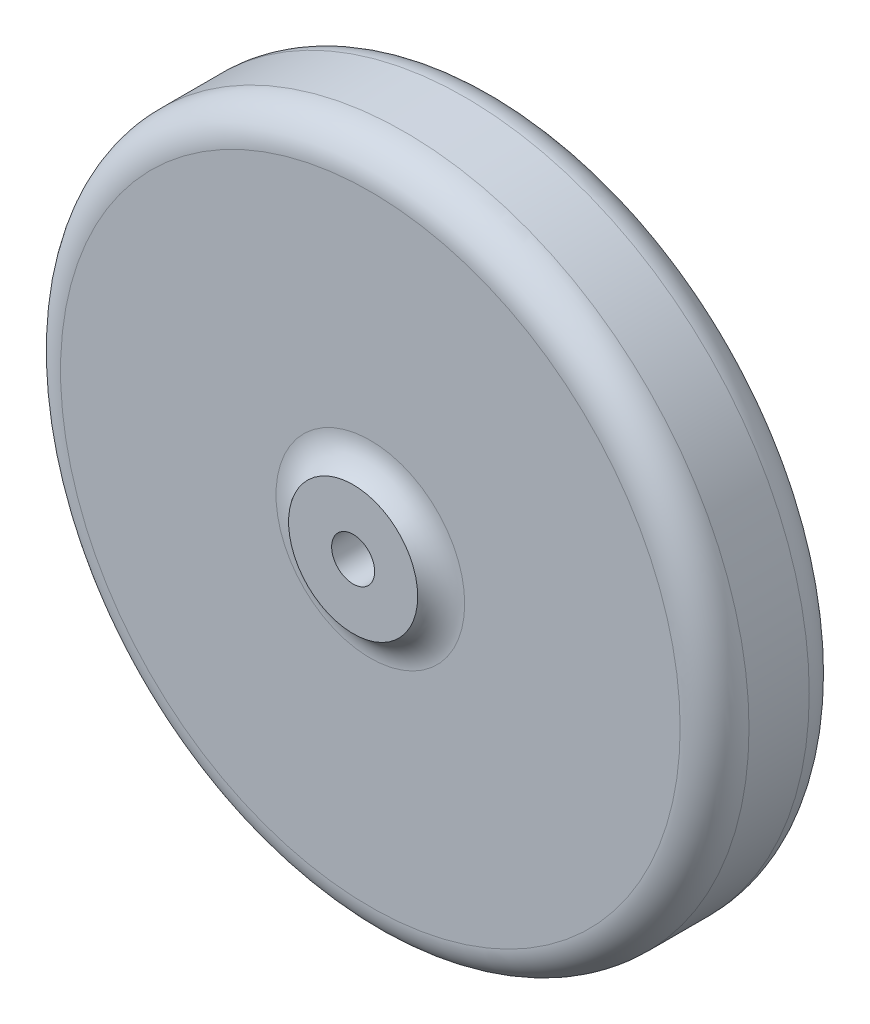
ISO-10303-21;
HEADER;
FILE_DESCRIPTION(('STEP AP214'),'2;1');
FILE_NAME('part.step','',(''),(''),'','','');
FILE_SCHEMA(('AUTOMOTIVE_DESIGN { 1 0 10303 214 1 1 1 1 }'));
ENDSEC;
DATA;
#1=APPLICATION_CONTEXT('core data for automotive mechanical design processes');
#2=APPLICATION_PROTOCOL_DEFINITION('international standard','automotive_design',2000,#1);
#3=PRODUCT_CONTEXT('',#1,'mechanical');
#4=PRODUCT('Part','Part','',(#3));
#5=PRODUCT_RELATED_PRODUCT_CATEGORY('part','',(#4));
#6=PRODUCT_DEFINITION_FORMATION('','',#4);
#7=PRODUCT_DEFINITION_CONTEXT('part definition',#1,'design');
#8=PRODUCT_DEFINITION('design','',#6,#7);
#9=PRODUCT_DEFINITION_SHAPE('','',#8);
#10=(LENGTH_UNIT() NAMED_UNIT(*) SI_UNIT(.MILLI.,.METRE.));
#11=(NAMED_UNIT(*) PLANE_ANGLE_UNIT() SI_UNIT($,.RADIAN.));
#12=(NAMED_UNIT(*) SI_UNIT($,.STERADIAN.) SOLID_ANGLE_UNIT());
#13=UNCERTAINTY_MEASURE_WITH_UNIT(LENGTH_MEASURE(1.E-05),#10,'distance_accuracy_value','');
#14=(GEOMETRIC_REPRESENTATION_CONTEXT(3) GLOBAL_UNCERTAINTY_ASSIGNED_CONTEXT((#13)) GLOBAL_UNIT_ASSIGNED_CONTEXT((#10,
#11,#12)) REPRESENTATION_CONTEXT('',''));
#15=CARTESIAN_POINT('',(0.,0.,0.));
#16=DIRECTION('',(0.,0.,1.));
#17=DIRECTION('',(1.,0.,0.));
#18=AXIS2_PLACEMENT_3D('',#15,#16,#17);
#19=CARTESIAN_POINT('',(0.,0.,11.90625));
#20=DIRECTION('',(0.,0.,-1.));
#21=DIRECTION('',(-1.,0.,0.));
#22=AXIS2_PLACEMENT_3D('',#19,#20,#21);
#23=CYLINDRICAL_SURFACE('',#22,63.5);
#24=CARTESIAN_POINT('',(0.,0.,-5.55625));
#25=DIRECTION('',(0.,0.,1.));
#26=DIRECTION('',(1.,0.,0.));
#27=AXIS2_PLACEMENT_3D('',#24,#25,#26);
#28=CIRCLE('',#27,63.5);
#29=CARTESIAN_POINT('',(63.5,0.,-5.55625));
#30=VERTEX_POINT('',#29);
#31=EDGE_CURVE('E42',#30,#30,#28,.T.);
#32=ORIENTED_EDGE('',*,*,#31,.T.);
#33=EDGE_LOOP('',(#32));
#34=FACE_BOUND('',#33,.T.);
#35=CARTESIAN_POINT('',(0.,0.,5.55625));
#36=DIRECTION('',(0.,0.,1.));
#37=DIRECTION('',(1.,0.,0.));
#38=AXIS2_PLACEMENT_3D('',#35,#36,#37);
#39=CIRCLE('',#38,63.5);
#40=CARTESIAN_POINT('',(63.5,0.,5.55625));
#41=VERTEX_POINT('',#40);
#42=EDGE_CURVE('E46',#41,#41,#39,.F.);
#43=ORIENTED_EDGE('',*,*,#42,.T.);
#44=EDGE_LOOP('',(#43));
#45=FACE_BOUND('',#44,.T.);
#46=ADVANCED_FACE('F31',(#34,#45),#23,.T.);
#47=CARTESIAN_POINT('',(0.,0.,11.90625));
#48=DIRECTION('',(0.,0.,1.));
#49=DIRECTION('',(1.,0.,0.));
#50=AXIS2_PLACEMENT_3D('',#47,#48,#49);
#51=PLANE('',#50);
#52=CARTESIAN_POINT('',(0.,0.,11.90625));
#53=DIRECTION('',(0.,0.,1.));
#54=DIRECTION('',(1.,0.,0.));
#55=AXIS2_PLACEMENT_3D('',#52,#53,#54);
#56=CIRCLE('',#55,57.15);
#57=CARTESIAN_POINT('',(57.15,0.,11.90625));
#58=VERTEX_POINT('',#57);
#59=EDGE_CURVE('E10',#58,#58,#56,.T.);
#60=ORIENTED_EDGE('',*,*,#59,.T.);
#61=EDGE_LOOP('',(#60));
#62=FACE_BOUND('',#61,.T.);
#63=CARTESIAN_POINT('',(0.,0.,11.90625));
#64=DIRECTION('',(0.,0.,1.));
#65=DIRECTION('',(1.,0.,0.));
#66=AXIS2_PLACEMENT_3D('',#63,#64,#65);
#67=CIRCLE('',#66,17.4055113140312);
#68=CARTESIAN_POINT('',(17.4055113140312,0.,11.90625));
#69=VERTEX_POINT('',#68);
#70=EDGE_CURVE('E38',#69,#69,#67,.F.);
#71=ORIENTED_EDGE('',*,*,#70,.T.);
#72=EDGE_LOOP('',(#71));
#73=FACE_BOUND('',#72,.T.);
#74=ADVANCED_FACE('F88',(#62,#73),#51,.T.);
#75=CARTESIAN_POINT('',(0.,0.,-11.90625));
#76=DIRECTION('',(0.,0.,1.));
#77=DIRECTION('',(1.,0.,0.));
#78=AXIS2_PLACEMENT_3D('',#75,#76,#77);
#79=PLANE('',#78);
#80=CARTESIAN_POINT('',(0.,0.,-11.90625));
#81=DIRECTION('',(0.,0.,1.));
#82=DIRECTION('',(1.,0.,0.));
#83=AXIS2_PLACEMENT_3D('',#80,#81,#82);
#84=CIRCLE('',#83,17.4055113140312);
#85=CARTESIAN_POINT('',(17.4055113140312,0.,-11.90625));
#86=VERTEX_POINT('',#85);
#87=EDGE_CURVE('E51',#86,#86,#84,.T.);
#88=ORIENTED_EDGE('',*,*,#87,.T.);
#89=EDGE_LOOP('',(#88));
#90=FACE_BOUND('',#89,.T.);
#91=CARTESIAN_POINT('',(0.,0.,-11.90625));
#92=DIRECTION('',(0.,0.,1.));
#93=DIRECTION('',(1.,0.,0.));
#94=AXIS2_PLACEMENT_3D('',#91,#92,#93);
#95=CIRCLE('',#94,57.15);
#96=CARTESIAN_POINT('',(57.15,0.,-11.90625));
#97=VERTEX_POINT('',#96);
#98=EDGE_CURVE('E54',#97,#97,#95,.F.);
#99=ORIENTED_EDGE('',*,*,#98,.T.);
#100=EDGE_LOOP('',(#99));
#101=FACE_BOUND('',#100,.T.);
#102=ADVANCED_FACE('F94',(#90,#101),#79,.F.);
#103=CARTESIAN_POINT('',(0.,0.,-15.08125));
#104=DIRECTION('',(0.,0.,1.));
#105=DIRECTION('',(1.,0.,0.));
#106=AXIS2_PLACEMENT_3D('',#103,#104,#105);
#107=PLANE('',#106);
#108=CARTESIAN_POINT('',(0.,0.,-15.08125));
#109=DIRECTION('',(0.,0.,1.));
#110=DIRECTION('',(1.,0.,0.));
#111=AXIS2_PLACEMENT_3D('',#108,#109,#110);
#112=CIRCLE('',#111,3.96875);
#113=CARTESIAN_POINT('',(3.96875,0.,-15.08125));
#114=VERTEX_POINT('',#113);
#115=EDGE_CURVE('E61',#114,#114,#112,.T.);
#116=ORIENTED_EDGE('',*,*,#115,.T.);
#117=EDGE_LOOP('',(#116));
#118=FACE_BOUND('',#117,.T.);
#119=CARTESIAN_POINT('',(0.,0.,-15.08125));
#120=DIRECTION('',(0.,0.,1.));
#121=DIRECTION('',(1.,0.,0.));
#122=AXIS2_PLACEMENT_3D('',#119,#120,#121);
#123=CIRCLE('',#122,11.90625);
#124=CARTESIAN_POINT('',(11.90625,0.,-15.08125));
#125=VERTEX_POINT('',#124);
#126=EDGE_CURVE('E58',#125,#125,#123,.T.);
#127=ORIENTED_EDGE('',*,*,#126,.F.);
#128=EDGE_LOOP('',(#127));
#129=FACE_BOUND('',#128,.T.);
#130=ADVANCED_FACE('F75',(#118,#129),#107,.F.);
#131=CARTESIAN_POINT('',(0.,0.,15.08125));
#132=DIRECTION('',(0.,0.,1.));
#133=DIRECTION('',(1.,0.,0.));
#134=AXIS2_PLACEMENT_3D('',#131,#132,#133);
#135=PLANE('',#134);
#136=CARTESIAN_POINT('',(0.,0.,15.08125));
#137=DIRECTION('',(0.,0.,1.));
#138=DIRECTION('',(1.,0.,0.));
#139=AXIS2_PLACEMENT_3D('',#136,#137,#138);
#140=CIRCLE('',#139,3.96875);
#141=CARTESIAN_POINT('',(3.96875,0.,15.08125));
#142=VERTEX_POINT('',#141);
#143=EDGE_CURVE('E66',#142,#142,#140,.T.);
#144=ORIENTED_EDGE('',*,*,#143,.F.);
#145=EDGE_LOOP('',(#144));
#146=FACE_BOUND('',#145,.T.);
#147=CARTESIAN_POINT('',(0.,0.,15.08125));
#148=DIRECTION('',(0.,0.,1.));
#149=DIRECTION('',(1.,0.,0.));
#150=AXIS2_PLACEMENT_3D('',#147,#148,#149);
#151=CIRCLE('',#150,11.90625);
#152=CARTESIAN_POINT('',(11.90625,0.,15.08125));
#153=VERTEX_POINT('',#152);
#154=EDGE_CURVE('E57',#153,#153,#151,.T.);
#155=ORIENTED_EDGE('',*,*,#154,.T.);
#156=EDGE_LOOP('',(#155));
#157=FACE_BOUND('',#156,.T.);
#158=ADVANCED_FACE('F72',(#146,#157),#135,.T.);
#159=CARTESIAN_POINT('',(0.,0.,-15.08125));
#160=DIRECTION('',(0.,0.,1.));
#161=DIRECTION('',(1.,0.,0.));
#162=AXIS2_PLACEMENT_3D('',#159,#160,#161);
#163=CYLINDRICAL_SURFACE('',#162,3.96875);
#164=CARTESIAN_POINT('',(3.96875,0.,-15.08125));
#165=CARTESIAN_POINT('',(3.96875,0.,-14.7670572916667));
#166=CARTESIAN_POINT('',(3.96875,0.,-14.4528645833333));
#167=CARTESIAN_POINT('',(3.96875,0.,-13.8244791666667));
#168=CARTESIAN_POINT('',(3.96875,0.,-13.5102864583333));
#169=CARTESIAN_POINT('',(3.96875,0.,-12.8819010416667));
#170=CARTESIAN_POINT('',(3.96875,0.,-12.5677083333333));
#171=CARTESIAN_POINT('',(3.96875,0.,-11.9393229166667));
#172=CARTESIAN_POINT('',(3.96875,0.,-11.6251302083333));
#173=CARTESIAN_POINT('',(3.96875,0.,-10.9967447916667));
#174=CARTESIAN_POINT('',(3.96875,0.,-10.6825520833333));
#175=CARTESIAN_POINT('',(3.96875,0.,-10.0541666666667));
#176=CARTESIAN_POINT('',(3.96875,0.,-9.73997395833333));
#177=CARTESIAN_POINT('',(3.96875,0.,-9.11158854166667));
#178=CARTESIAN_POINT('',(3.96875,0.,-8.79739583333333));
#179=CARTESIAN_POINT('',(3.96875,0.,-8.16901041666667));
#180=CARTESIAN_POINT('',(3.96875,0.,-7.85481770833333));
#181=CARTESIAN_POINT('',(3.96875,0.,-7.22643229166667));
#182=CARTESIAN_POINT('',(3.96875,0.,-6.91223958333333));
#183=CARTESIAN_POINT('',(3.96875,0.,-6.28385416666667));
#184=CARTESIAN_POINT('',(3.96875,0.,-5.96966145833334));
#185=CARTESIAN_POINT('',(3.96875,0.,-5.34127604166667));
#186=CARTESIAN_POINT('',(3.96875,0.,-5.02708333333334));
#187=CARTESIAN_POINT('',(3.96875,0.,-4.39869791666667));
#188=CARTESIAN_POINT('',(3.96875,0.,-4.08450520833334));
#189=CARTESIAN_POINT('',(3.96875,0.,-3.45611979166667));
#190=CARTESIAN_POINT('',(3.96875,0.,-3.14192708333334));
#191=CARTESIAN_POINT('',(3.96875,0.,-2.51354166666667));
#192=CARTESIAN_POINT('',(3.96875,0.,-2.19934895833334));
#193=CARTESIAN_POINT('',(3.96875,0.,-1.57096354166667));
#194=CARTESIAN_POINT('',(3.96875,0.,-1.25677083333333));
#195=CARTESIAN_POINT('',(3.96875,0.,-0.628385416666668));
#196=CARTESIAN_POINT('',(3.96875,0.,-0.314192708333335));
#197=CARTESIAN_POINT('',(3.96875,0.,0.314192708333331));
#198=CARTESIAN_POINT('',(3.96875,0.,0.628385416666664));
#199=CARTESIAN_POINT('',(3.96875,0.,1.25677083333333));
#200=CARTESIAN_POINT('',(3.96875,0.,1.57096354166666));
#201=CARTESIAN_POINT('',(3.96875,0.,2.19934895833333));
#202=CARTESIAN_POINT('',(3.96875,0.,2.51354166666667));
#203=CARTESIAN_POINT('',(3.96875,0.,3.14192708333333));
#204=CARTESIAN_POINT('',(3.96875,0.,3.45611979166667));
#205=CARTESIAN_POINT('',(3.96875,0.,4.08450520833333));
#206=CARTESIAN_POINT('',(3.96875,0.,4.39869791666667));
#207=CARTESIAN_POINT('',(3.96875,0.,5.02708333333333));
#208=CARTESIAN_POINT('',(3.96875,0.,5.34127604166666));
#209=CARTESIAN_POINT('',(3.96875,0.,5.96966145833333));
#210=CARTESIAN_POINT('',(3.96875,0.,6.28385416666666));
#211=CARTESIAN_POINT('',(3.96875,0.,6.91223958333333));
#212=CARTESIAN_POINT('',(3.96875,0.,7.22643229166666));
#213=CARTESIAN_POINT('',(3.96875,0.,7.85481770833333));
#214=CARTESIAN_POINT('',(3.96875,0.,8.16901041666667));
#215=CARTESIAN_POINT('',(3.96875,0.,8.79739583333333));
#216=CARTESIAN_POINT('',(3.96875,0.,9.11158854166667));
#217=CARTESIAN_POINT('',(3.96875,0.,9.73997395833333));
#218=CARTESIAN_POINT('',(3.96875,0.,10.0541666666667));
#219=CARTESIAN_POINT('',(3.96875,0.,10.6825520833333));
#220=CARTESIAN_POINT('',(3.96875,0.,10.9967447916667));
#221=CARTESIAN_POINT('',(3.96875,0.,11.6251302083333));
#222=CARTESIAN_POINT('',(3.96875,0.,11.9393229166667));
#223=CARTESIAN_POINT('',(3.96875,0.,12.5677083333333));
#224=CARTESIAN_POINT('',(3.96875,0.,12.8819010416667));
#225=CARTESIAN_POINT('',(3.96875,0.,13.5102864583333));
#226=CARTESIAN_POINT('',(3.96875,0.,13.8244791666667));
#227=CARTESIAN_POINT('',(3.96875,0.,14.4528645833333));
#228=CARTESIAN_POINT('',(3.96875,0.,14.7670572916667));
#229=CARTESIAN_POINT('',(3.96875,0.,15.08125));
#230=B_SPLINE_CURVE_WITH_KNOTS('',3,(#164,#165,#166,#167,#168,#169,#170,#171,#172,#173,#174,
#175,#176,#177,#178,#179,#180,#181,#182,#183,#184,#185,#186,#187,#188,#189,#190,#191,#192,#193,
#194,#195,#196,#197,#198,#199,#200,#201,#202,#203,#204,#205,#206,#207,#208,#209,#210,#211,#212,
#213,#214,#215,#216,#217,#218,#219,#220,#221,#222,#223,#224,#225,#226,#227,#228,#229),
.UNSPECIFIED.,.F.,.F.,(4,2,2,2,2,2,2,2,2,2,2,2,2,2,2,2,2,2,2,2,2,2,2,2,2,2,2,2,2,2,2,2,4),(0.,
0.942578125000001,1.88515625,2.827734375,3.7703125,4.712890625,5.65546875,6.598046875,7.540625,
8.483203125,9.42578125,10.368359375,11.3109375,12.253515625,13.19609375,14.138671875,15.08125,
16.023828125,16.96640625,17.908984375,18.8515625,19.794140625,20.73671875,21.679296875,
22.621875,23.564453125,24.50703125,25.449609375,26.3921875,27.334765625,28.27734375,
29.219921875,30.1625),.UNSPECIFIED.);
#231=EDGE_CURVE('BSEAM70',#114,#142,#230,.T.);
#232=ORIENTED_EDGE('',*,*,#115,.F.);
#233=ORIENTED_EDGE('',*,*,#143,.T.);
#234=ORIENTED_EDGE('',*,*,#231,.T.);
#235=ORIENTED_EDGE('',*,*,#231,.F.);
#236=EDGE_LOOP('',(#232,#234,#233,#235));
#237=FACE_BOUND('',#236,.T.);
#238=ADVANCED_FACE('F70',(#237),#163,.F.);
#239=CARTESIAN_POINT('',(0.,0.,-18.25625));
#240=DIRECTION('',(0.,0.,1.));
#241=DIRECTION('',(1.,0.,0.));
#242=AXIS2_PLACEMENT_3D('',#239,#240,#241);
#243=TOROIDAL_SURFACE('',#242,17.4055113140312,6.35);
#244=ORIENTED_EDGE('',*,*,#87,.F.);
#245=EDGE_LOOP('',(#244));
#246=FACE_BOUND('',#245,.T.);
#247=ORIENTED_EDGE('',*,*,#126,.T.);
#248=EDGE_LOOP('',(#247));
#249=FACE_BOUND('',#248,.T.);
#250=ADVANCED_FACE('F99',(#246,#249),#243,.F.);
#251=CARTESIAN_POINT('',(0.,0.,-5.55625));
#252=DIRECTION('',(0.,0.,1.));
#253=DIRECTION('',(1.,0.,0.));
#254=AXIS2_PLACEMENT_3D('',#251,#252,#253);
#255=TOROIDAL_SURFACE('',#254,57.15,6.35);
#256=ORIENTED_EDGE('',*,*,#98,.F.);
#257=EDGE_LOOP('',(#256));
#258=FACE_BOUND('',#257,.T.);
#259=ORIENTED_EDGE('',*,*,#31,.F.);
#260=EDGE_LOOP('',(#259));
#261=FACE_BOUND('',#260,.T.);
#262=ADVANCED_FACE('F85',(#258,#261),#255,.T.);
#263=CARTESIAN_POINT('',(0.,0.,5.55625));
#264=DIRECTION('',(0.,0.,1.));
#265=DIRECTION('',(1.,0.,0.));
#266=AXIS2_PLACEMENT_3D('',#263,#264,#265);
#267=TOROIDAL_SURFACE('',#266,57.15,6.35);
#268=ORIENTED_EDGE('',*,*,#42,.F.);
#269=EDGE_LOOP('',(#268));
#270=FACE_BOUND('',#269,.T.);
#271=ORIENTED_EDGE('',*,*,#59,.F.);
#272=EDGE_LOOP('',(#271));
#273=FACE_BOUND('',#272,.T.);
#274=ADVANCED_FACE('F81',(#270,#273),#267,.T.);
#275=CARTESIAN_POINT('',(0.,0.,18.25625));
#276=DIRECTION('',(0.,0.,1.));
#277=DIRECTION('',(1.,0.,0.));
#278=AXIS2_PLACEMENT_3D('',#275,#276,#277);
#279=TOROIDAL_SURFACE('',#278,17.4055113140312,6.35);
#280=ORIENTED_EDGE('',*,*,#154,.F.);
#281=EDGE_LOOP('',(#280));
#282=FACE_BOUND('',#281,.T.);
#283=ORIENTED_EDGE('',*,*,#70,.F.);
#284=EDGE_LOOP('',(#283));
#285=FACE_BOUND('',#284,.T.);
#286=ADVANCED_FACE('F33',(#282,#285),#279,.F.);
#287=CLOSED_SHELL('',(#46,#74,#102,#130,#158,#238,#250,#262,#274,#286));
#288=MANIFOLD_SOLID_BREP('B2',#287);
#289=ADVANCED_BREP_SHAPE_REPRESENTATION('',(#18,#288),#14);
#290=SHAPE_DEFINITION_REPRESENTATION(#9,#289);
ENDSEC;
END-ISO-10303-21;
